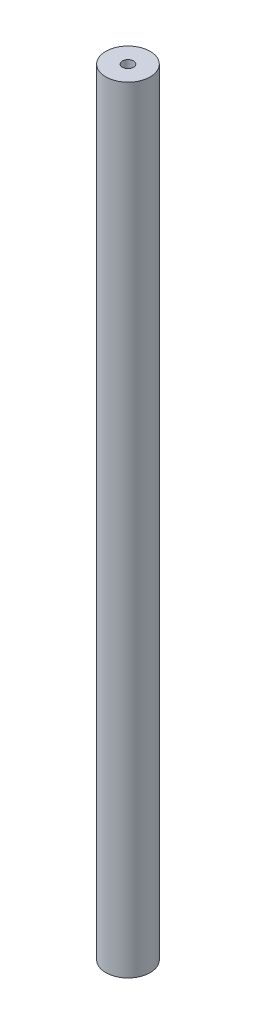
ISO-10303-21;
HEADER;
FILE_DESCRIPTION(('STEP AP214'),'2;1');
FILE_NAME('part.step','',(''),(''),'','','');
FILE_SCHEMA(('AUTOMOTIVE_DESIGN { 1 0 10303 214 1 1 1 1 }'));
ENDSEC;
DATA;
#1=APPLICATION_CONTEXT('core data for automotive mechanical design processes');
#2=APPLICATION_PROTOCOL_DEFINITION('international standard','automotive_design',2000,#1);
#3=PRODUCT_CONTEXT('',#1,'mechanical');
#4=PRODUCT('Part','Part','',(#3));
#5=PRODUCT_RELATED_PRODUCT_CATEGORY('part','',(#4));
#6=PRODUCT_DEFINITION_FORMATION('','',#4);
#7=PRODUCT_DEFINITION_CONTEXT('part definition',#1,'design');
#8=PRODUCT_DEFINITION('design','',#6,#7);
#9=PRODUCT_DEFINITION_SHAPE('','',#8);
#10=(LENGTH_UNIT() NAMED_UNIT(*) SI_UNIT(.MILLI.,.METRE.));
#11=(NAMED_UNIT(*) PLANE_ANGLE_UNIT() SI_UNIT($,.RADIAN.));
#12=(NAMED_UNIT(*) SI_UNIT($,.STERADIAN.) SOLID_ANGLE_UNIT());
#13=UNCERTAINTY_MEASURE_WITH_UNIT(LENGTH_MEASURE(1.E-05),#10,'distance_accuracy_value','');
#14=(GEOMETRIC_REPRESENTATION_CONTEXT(3) GLOBAL_UNCERTAINTY_ASSIGNED_CONTEXT((#13)) GLOBAL_UNIT_ASSIGNED_CONTEXT((#10,
#11,#12)) REPRESENTATION_CONTEXT('',''));
#15=CARTESIAN_POINT('',(0.,0.,0.));
#16=DIRECTION('',(0.,0.,1.));
#17=DIRECTION('',(1.,0.,0.));
#18=AXIS2_PLACEMENT_3D('',#15,#16,#17);
#19=CARTESIAN_POINT('',(0.,444.5,0.));
#20=DIRECTION('',(0.,-1.,0.));
#21=DIRECTION('',(0.,0.,-1.));
#22=AXIS2_PLACEMENT_3D('',#19,#20,#21);
#23=CYLINDRICAL_SURFACE('',#22,12.7);
#24=CARTESIAN_POINT('',(0.,444.5,0.));
#25=DIRECTION('',(0.,1.,0.));
#26=DIRECTION('',(0.,0.,1.));
#27=AXIS2_PLACEMENT_3D('',#24,#25,#26);
#28=CIRCLE('',#27,12.7);
#29=CARTESIAN_POINT('',(0.,444.5,12.7));
#30=VERTEX_POINT('',#29);
#31=EDGE_CURVE('E10',#30,#30,#28,.T.);
#32=ORIENTED_EDGE('',*,*,#31,.F.);
#33=EDGE_LOOP('',(#32));
#34=FACE_BOUND('',#33,.T.);
#35=CARTESIAN_POINT('',(0.,0.,0.));
#36=DIRECTION('',(0.,1.,0.));
#37=DIRECTION('',(0.,0.,1.));
#38=AXIS2_PLACEMENT_3D('',#35,#36,#37);
#39=CIRCLE('',#38,12.7);
#40=CARTESIAN_POINT('',(0.,0.,12.7));
#41=VERTEX_POINT('',#40);
#42=EDGE_CURVE('E45',#41,#41,#39,.T.);
#43=ORIENTED_EDGE('',*,*,#42,.T.);
#44=EDGE_LOOP('',(#43));
#45=FACE_BOUND('',#44,.T.);
#46=ADVANCED_FACE('F42',(#34,#45),#23,.T.);
#47=CARTESIAN_POINT('',(0.,444.5,0.));
#48=DIRECTION('',(0.,1.,0.));
#49=DIRECTION('',(0.,0.,1.));
#50=AXIS2_PLACEMENT_3D('',#47,#48,#49);
#51=PLANE('',#50);
#52=CARTESIAN_POINT('',(0.,444.5,0.));
#53=DIRECTION('',(0.,1.,0.));
#54=DIRECTION('',(0.,0.,1.));
#55=AXIS2_PLACEMENT_3D('',#52,#53,#54);
#56=CIRCLE('',#55,3.175);
#57=CARTESIAN_POINT('',(0.,444.5,3.175));
#58=VERTEX_POINT('',#57);
#59=EDGE_CURVE('E56',#58,#58,#56,.T.);
#60=ORIENTED_EDGE('',*,*,#59,.F.);
#61=EDGE_LOOP('',(#60));
#62=FACE_BOUND('',#61,.T.);
#63=ORIENTED_EDGE('',*,*,#31,.T.);
#64=EDGE_LOOP('',(#63));
#65=FACE_BOUND('',#64,.T.);
#66=ADVANCED_FACE('F84',(#62,#65),#51,.T.);
#67=CARTESIAN_POINT('',(0.,0.,0.));
#68=DIRECTION('',(0.,1.,0.));
#69=DIRECTION('',(0.,0.,1.));
#70=AXIS2_PLACEMENT_3D('',#67,#68,#69);
#71=PLANE('',#70);
#72=CARTESIAN_POINT('',(0.,0.,0.));
#73=DIRECTION('',(0.,1.,0.));
#74=DIRECTION('',(0.,0.,1.));
#75=AXIS2_PLACEMENT_3D('',#72,#73,#74);
#76=CIRCLE('',#75,3.175);
#77=CARTESIAN_POINT('',(0.,0.,3.175));
#78=VERTEX_POINT('',#77);
#79=EDGE_CURVE('E64',#78,#78,#76,.T.);
#80=ORIENTED_EDGE('',*,*,#79,.T.);
#81=EDGE_LOOP('',(#80));
#82=FACE_BOUND('',#81,.T.);
#83=ORIENTED_EDGE('',*,*,#42,.F.);
#84=EDGE_LOOP('',(#83));
#85=FACE_BOUND('',#84,.T.);
#86=ADVANCED_FACE('F89',(#82,#85),#71,.F.);
#87=CARTESIAN_POINT('',(0.,419.1,0.));
#88=DIRECTION('',(0.,1.,0.));
#89=DIRECTION('',(0.,0.,1.));
#90=AXIS2_PLACEMENT_3D('',#87,#88,#89);
#91=CYLINDRICAL_SURFACE('',#90,3.175);
#92=CARTESIAN_POINT('',(0.,419.1,0.));
#93=DIRECTION('',(0.,1.,0.));
#94=DIRECTION('',(0.,0.,1.));
#95=AXIS2_PLACEMENT_3D('',#92,#93,#94);
#96=CIRCLE('',#95,3.175);
#97=CARTESIAN_POINT('',(0.,419.1,3.175));
#98=VERTEX_POINT('',#97);
#99=EDGE_CURVE('E54',#98,#98,#96,.T.);
#100=ORIENTED_EDGE('',*,*,#99,.F.);
#101=EDGE_LOOP('',(#100));
#102=FACE_BOUND('',#101,.T.);
#103=ORIENTED_EDGE('',*,*,#59,.T.);
#104=EDGE_LOOP('',(#103));
#105=FACE_BOUND('',#104,.T.);
#106=ADVANCED_FACE('F96',(#102,#105),#91,.F.);
#107=CARTESIAN_POINT('',(0.,419.1,0.));
#108=DIRECTION('',(0.,1.,0.));
#109=DIRECTION('',(0.,0.,1.));
#110=AXIS2_PLACEMENT_3D('',#107,#108,#109);
#111=PLANE('',#110);
#112=ORIENTED_EDGE('',*,*,#99,.T.);
#113=EDGE_LOOP('',(#112));
#114=FACE_BOUND('',#113,.T.);
#115=ADVANCED_FACE('F81',(#114),#111,.T.);
#116=CARTESIAN_POINT('',(0.,25.4,0.));
#117=DIRECTION('',(0.,-1.,0.));
#118=DIRECTION('',(0.,0.,-1.));
#119=AXIS2_PLACEMENT_3D('',#116,#117,#118);
#120=CYLINDRICAL_SURFACE('',#119,3.175);
#121=CARTESIAN_POINT('',(0.,25.4,0.));
#122=DIRECTION('',(0.,1.,0.));
#123=DIRECTION('',(0.,0.,1.));
#124=AXIS2_PLACEMENT_3D('',#121,#122,#123);
#125=CIRCLE('',#124,3.175);
#126=CARTESIAN_POINT('',(0.,25.4,3.175));
#127=VERTEX_POINT('',#126);
#128=EDGE_CURVE('E60',#127,#127,#125,.T.);
#129=ORIENTED_EDGE('',*,*,#128,.T.);
#130=EDGE_LOOP('',(#129));
#131=FACE_BOUND('',#130,.T.);
#132=ORIENTED_EDGE('',*,*,#79,.F.);
#133=EDGE_LOOP('',(#132));
#134=FACE_BOUND('',#133,.T.);
#135=ADVANCED_FACE('F72',(#131,#134),#120,.F.);
#136=CARTESIAN_POINT('',(0.,25.4,0.));
#137=DIRECTION('',(0.,-1.,0.));
#138=DIRECTION('',(0.,0.,1.));
#139=AXIS2_PLACEMENT_3D('',#136,#137,#138);
#140=PLANE('',#139);
#141=ORIENTED_EDGE('',*,*,#128,.F.);
#142=EDGE_LOOP('',(#141));
#143=FACE_BOUND('',#142,.T.);
#144=ADVANCED_FACE('F75',(#143),#140,.T.);
#145=CLOSED_SHELL('',(#46,#66,#86,#106,#115,#135,#144));
#146=MANIFOLD_SOLID_BREP('B2',#145);
#147=ADVANCED_BREP_SHAPE_REPRESENTATION('',(#18,#146),#14);
#148=SHAPE_DEFINITION_REPRESENTATION(#9,#147);
ENDSEC;
END-ISO-10303-21;
